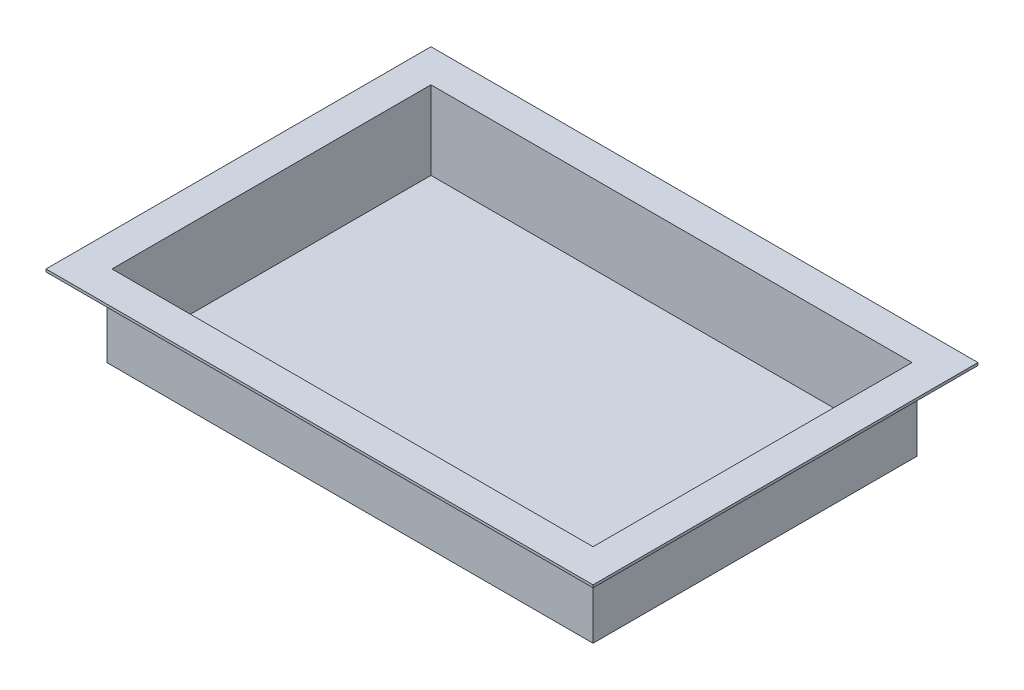
ISO-10303-21;
HEADER;
FILE_DESCRIPTION(('STEP AP214'),'2;1');
FILE_NAME('part.step','',(''),(''),'','','');
FILE_SCHEMA(('AUTOMOTIVE_DESIGN { 1 0 10303 214 1 1 1 1 }'));
ENDSEC;
DATA;
#1=APPLICATION_CONTEXT('core data for automotive mechanical design processes');
#2=APPLICATION_PROTOCOL_DEFINITION('international standard','automotive_design',2000,#1);
#3=PRODUCT_CONTEXT('',#1,'mechanical');
#4=PRODUCT('Part','Part','',(#3));
#5=PRODUCT_RELATED_PRODUCT_CATEGORY('part','',(#4));
#6=PRODUCT_DEFINITION_FORMATION('','',#4);
#7=PRODUCT_DEFINITION_CONTEXT('part definition',#1,'design');
#8=PRODUCT_DEFINITION('design','',#6,#7);
#9=PRODUCT_DEFINITION_SHAPE('','',#8);
#10=(LENGTH_UNIT() NAMED_UNIT(*) SI_UNIT(.MILLI.,.METRE.));
#11=(NAMED_UNIT(*) PLANE_ANGLE_UNIT() SI_UNIT($,.RADIAN.));
#12=(NAMED_UNIT(*) SI_UNIT($,.STERADIAN.) SOLID_ANGLE_UNIT());
#13=UNCERTAINTY_MEASURE_WITH_UNIT(LENGTH_MEASURE(1.E-05),#10,'distance_accuracy_value','');
#14=(GEOMETRIC_REPRESENTATION_CONTEXT(3) GLOBAL_UNCERTAINTY_ASSIGNED_CONTEXT((#13)) GLOBAL_UNIT_ASSIGNED_CONTEXT((#10,
#11,#12)) REPRESENTATION_CONTEXT('',''));
#15=CARTESIAN_POINT('',(0.,0.,0.));
#16=DIRECTION('',(0.,0.,1.));
#17=DIRECTION('',(1.,0.,0.));
#18=AXIS2_PLACEMENT_3D('',#15,#16,#17);
#19=CARTESIAN_POINT('',(76.2,0.,50.8));
#20=DIRECTION('',(0.,1.,0.));
#21=DIRECTION('',(0.,0.,1.));
#22=AXIS2_PLACEMENT_3D('',#19,#20,#21);
#23=PLANE('',#22);
#24=DIRECTION('',(0.,0.,-1.));
#25=VECTOR('',#24,1.);
#26=CARTESIAN_POINT('',(75.3872,0.,50.8));
#27=LINE('',#26,#25);
#28=CARTESIAN_POINT('',(75.3872,0.,49.9872));
#29=VERTEX_POINT('',#28);
#30=CARTESIAN_POINT('',(75.3872,0.,-49.9872));
#31=VERTEX_POINT('',#30);
#32=EDGE_CURVE('E160',#29,#31,#27,.T.);
#33=ORIENTED_EDGE('',*,*,#32,.F.);
#34=DIRECTION('',(1.,0.,0.));
#35=VECTOR('',#34,1.);
#36=CARTESIAN_POINT('',(76.2,0.,49.9872));
#37=LINE('',#36,#35);
#38=CARTESIAN_POINT('',(-75.3872,0.,49.9872));
#39=VERTEX_POINT('',#38);
#40=EDGE_CURVE('E152',#39,#29,#37,.T.);
#41=ORIENTED_EDGE('',*,*,#40,.F.);
#42=DIRECTION('',(0.,0.,1.));
#43=VECTOR('',#42,1.);
#44=CARTESIAN_POINT('',(-75.3872,0.,50.8));
#45=LINE('',#44,#43);
#46=CARTESIAN_POINT('',(-75.3872,0.,-49.9872));
#47=VERTEX_POINT('',#46);
#48=EDGE_CURVE('E56',#47,#39,#45,.T.);
#49=ORIENTED_EDGE('',*,*,#48,.F.);
#50=DIRECTION('',(-1.,0.,0.));
#51=VECTOR('',#50,1.);
#52=CARTESIAN_POINT('',(76.2,0.,-49.9872));
#53=LINE('',#52,#51);
#54=EDGE_CURVE('E157',#31,#47,#53,.T.);
#55=ORIENTED_EDGE('',*,*,#54,.F.);
#56=EDGE_LOOP('',(#33,#41,#49,#55));
#57=FACE_BOUND('',#56,.T.);
#58=DIRECTION('',(-1.,0.,0.));
#59=VECTOR('',#58,1.);
#60=CARTESIAN_POINT('',(85.725,0.,-60.325));
#61=LINE('',#60,#59);
#62=CARTESIAN_POINT('',(85.725,0.,-60.325));
#63=VERTEX_POINT('',#62);
#64=CARTESIAN_POINT('',(-85.725,0.,-60.3249999999999));
#65=VERTEX_POINT('',#64);
#66=EDGE_CURVE('E200',#63,#65,#61,.T.);
#67=ORIENTED_EDGE('',*,*,#66,.T.);
#68=DIRECTION('',(0.,0.,1.));
#69=VECTOR('',#68,1.);
#70=CARTESIAN_POINT('',(-85.725,0.,-60.3249999999999));
#71=LINE('',#70,#69);
#72=CARTESIAN_POINT('',(-85.725,0.,60.325));
#73=VERTEX_POINT('',#72);
#74=EDGE_CURVE('E197',#65,#73,#71,.T.);
#75=ORIENTED_EDGE('',*,*,#74,.T.);
#76=DIRECTION('',(1.,0.,0.));
#77=VECTOR('',#76,1.);
#78=CARTESIAN_POINT('',(-85.725,0.,60.325));
#79=LINE('',#78,#77);
#80=CARTESIAN_POINT('',(85.725,0.,60.325));
#81=VERTEX_POINT('',#80);
#82=EDGE_CURVE('E194',#73,#81,#79,.T.);
#83=ORIENTED_EDGE('',*,*,#82,.T.);
#84=DIRECTION('',(0.,0.,-1.));
#85=VECTOR('',#84,1.);
#86=CARTESIAN_POINT('',(85.725,0.,60.325));
#87=LINE('',#86,#85);
#88=EDGE_CURVE('E190',#81,#63,#87,.T.);
#89=ORIENTED_EDGE('',*,*,#88,.T.);
#90=EDGE_LOOP('',(#67,#75,#83,#89));
#91=FACE_BOUND('',#90,.T.);
#92=ADVANCED_FACE('F31',(#57,#91),#23,.T.);
#93=CARTESIAN_POINT('',(75.3872,-25.4,-50.8));
#94=DIRECTION('',(1.,0.,0.));
#95=DIRECTION('',(0.,0.,-1.));
#96=AXIS2_PLACEMENT_3D('',#93,#94,#95);
#97=PLANE('',#96);
#98=ORIENTED_EDGE('',*,*,#32,.T.);
#99=DIRECTION('',(0.,1.,0.));
#100=VECTOR('',#99,1.);
#101=CARTESIAN_POINT('',(75.3872,-25.4,-49.9872));
#102=LINE('',#101,#100);
#103=CARTESIAN_POINT('',(75.3872,-24.5872,-49.9872));
#104=VERTEX_POINT('',#103);
#105=EDGE_CURVE('E174',#104,#31,#102,.T.);
#106=ORIENTED_EDGE('',*,*,#105,.F.);
#107=DIRECTION('',(0.,0.,-1.));
#108=VECTOR('',#107,1.);
#109=CARTESIAN_POINT('',(75.3872,-24.5872,50.8));
#110=LINE('',#109,#108);
#111=CARTESIAN_POINT('',(75.3872,-24.5872,49.9872));
#112=VERTEX_POINT('',#111);
#113=EDGE_CURVE('E155',#112,#104,#110,.T.);
#114=ORIENTED_EDGE('',*,*,#113,.F.);
#115=DIRECTION('',(0.,1.,0.));
#116=VECTOR('',#115,1.);
#117=CARTESIAN_POINT('',(75.3872,-25.4,49.9872));
#118=LINE('',#117,#116);
#119=EDGE_CURVE('E151',#112,#29,#118,.T.);
#120=ORIENTED_EDGE('',*,*,#119,.T.);
#121=EDGE_LOOP('',(#98,#106,#114,#120));
#122=FACE_BOUND('',#121,.T.);
#123=ADVANCED_FACE('F232',(#122),#97,.F.);
#124=CARTESIAN_POINT('',(-76.2,-25.4,49.9872));
#125=DIRECTION('',(0.,0.,1.));
#126=DIRECTION('',(1.,0.,0.));
#127=AXIS2_PLACEMENT_3D('',#124,#125,#126);
#128=PLANE('',#127);
#129=ORIENTED_EDGE('',*,*,#40,.T.);
#130=ORIENTED_EDGE('',*,*,#119,.F.);
#131=DIRECTION('',(1.,0.,0.));
#132=VECTOR('',#131,1.);
#133=CARTESIAN_POINT('',(76.2,-24.5872,49.9872));
#134=LINE('',#133,#132);
#135=CARTESIAN_POINT('',(-75.3872,-24.5872,49.9872));
#136=VERTEX_POINT('',#135);
#137=EDGE_CURVE('E170',#136,#112,#134,.T.);
#138=ORIENTED_EDGE('',*,*,#137,.F.);
#139=DIRECTION('',(0.,1.,0.));
#140=VECTOR('',#139,1.);
#141=CARTESIAN_POINT('',(-75.3872,-25.4,49.9872));
#142=LINE('',#141,#140);
#143=EDGE_CURVE('E173',#136,#39,#142,.T.);
#144=ORIENTED_EDGE('',*,*,#143,.T.);
#145=EDGE_LOOP('',(#129,#130,#138,#144));
#146=FACE_BOUND('',#145,.T.);
#147=ADVANCED_FACE('F238',(#146),#128,.F.);
#148=CARTESIAN_POINT('',(-75.3872,-25.4,-50.8));
#149=DIRECTION('',(-1.,0.,0.));
#150=DIRECTION('',(0.,0.,1.));
#151=AXIS2_PLACEMENT_3D('',#148,#149,#150);
#152=PLANE('',#151);
#153=ORIENTED_EDGE('',*,*,#48,.T.);
#154=ORIENTED_EDGE('',*,*,#143,.F.);
#155=DIRECTION('',(0.,0.,1.));
#156=VECTOR('',#155,1.);
#157=CARTESIAN_POINT('',(-75.3872,-24.5872,50.8));
#158=LINE('',#157,#156);
#159=CARTESIAN_POINT('',(-75.3872,-24.5872,-49.9872));
#160=VERTEX_POINT('',#159);
#161=EDGE_CURVE('E167',#160,#136,#158,.T.);
#162=ORIENTED_EDGE('',*,*,#161,.F.);
#163=DIRECTION('',(0.,1.,0.));
#164=VECTOR('',#163,1.);
#165=CARTESIAN_POINT('',(-75.3872,-25.4,-49.9872));
#166=LINE('',#165,#164);
#167=EDGE_CURVE('E171',#160,#47,#166,.T.);
#168=ORIENTED_EDGE('',*,*,#167,.T.);
#169=EDGE_LOOP('',(#153,#154,#162,#168));
#170=FACE_BOUND('',#169,.T.);
#171=ADVANCED_FACE('F339',(#170),#152,.F.);
#172=CARTESIAN_POINT('',(-76.2,-25.4,-49.9872));
#173=DIRECTION('',(0.,0.,-1.));
#174=DIRECTION('',(-1.,0.,0.));
#175=AXIS2_PLACEMENT_3D('',#172,#173,#174);
#176=PLANE('',#175);
#177=ORIENTED_EDGE('',*,*,#54,.T.);
#178=ORIENTED_EDGE('',*,*,#167,.F.);
#179=DIRECTION('',(-1.,0.,0.));
#180=VECTOR('',#179,1.);
#181=CARTESIAN_POINT('',(76.2,-24.5872,-49.9872));
#182=LINE('',#181,#180);
#183=EDGE_CURVE('E164',#104,#160,#182,.T.);
#184=ORIENTED_EDGE('',*,*,#183,.F.);
#185=ORIENTED_EDGE('',*,*,#105,.T.);
#186=EDGE_LOOP('',(#177,#178,#184,#185));
#187=FACE_BOUND('',#186,.T.);
#188=ADVANCED_FACE('F330',(#187),#176,.F.);
#189=CARTESIAN_POINT('',(76.2,-24.5872,50.8));
#190=DIRECTION('',(0.,1.,0.));
#191=DIRECTION('',(0.,0.,1.));
#192=AXIS2_PLACEMENT_3D('',#189,#190,#191);
#193=PLANE('',#192);
#194=ORIENTED_EDGE('',*,*,#113,.T.);
#195=ORIENTED_EDGE('',*,*,#183,.T.);
#196=ORIENTED_EDGE('',*,*,#161,.T.);
#197=ORIENTED_EDGE('',*,*,#137,.T.);
#198=EDGE_LOOP('',(#194,#195,#196,#197));
#199=FACE_BOUND('',#198,.T.);
#200=ADVANCED_FACE('F316',(#199),#193,.T.);
#201=CARTESIAN_POINT('',(85.725,-0.812799999999999,-60.325));
#202=DIRECTION('',(0.,0.,-1.));
#203=DIRECTION('',(-1.,0.,0.));
#204=AXIS2_PLACEMENT_3D('',#201,#202,#203);
#205=PLANE('',#204);
#206=ORIENTED_EDGE('',*,*,#66,.F.);
#207=DIRECTION('',(0.,1.,0.));
#208=VECTOR('',#207,1.);
#209=CARTESIAN_POINT('',(85.725,-0.812799999999999,-60.325));
#210=LINE('',#209,#208);
#211=CARTESIAN_POINT('',(85.725,-0.812799999999999,-60.325));
#212=VERTEX_POINT('',#211);
#213=EDGE_CURVE('E163',#212,#63,#210,.T.);
#214=ORIENTED_EDGE('',*,*,#213,.F.);
#215=DIRECTION('',(-1.,0.,0.));
#216=VECTOR('',#215,1.);
#217=CARTESIAN_POINT('',(85.725,-0.812799999999999,-60.325));
#218=LINE('',#217,#216);
#219=CARTESIAN_POINT('',(-85.725,-0.812799999999999,-60.3249999999999));
#220=VERTEX_POINT('',#219);
#221=EDGE_CURVE('E193',#212,#220,#218,.T.);
#222=ORIENTED_EDGE('',*,*,#221,.T.);
#223=DIRECTION('',(0.,1.,0.));
#224=VECTOR('',#223,1.);
#225=CARTESIAN_POINT('',(-85.725,-0.812799999999999,-60.3249999999999));
#226=LINE('',#225,#224);
#227=EDGE_CURVE('E182',#220,#65,#226,.T.);
#228=ORIENTED_EDGE('',*,*,#227,.T.);
#229=EDGE_LOOP('',(#206,#214,#222,#228));
#230=FACE_BOUND('',#229,.T.);
#231=ADVANCED_FACE('F217',(#230),#205,.T.);
#232=CARTESIAN_POINT('',(85.725,-0.812799999999999,60.325));
#233=DIRECTION('',(1.,0.,0.));
#234=DIRECTION('',(0.,0.,-1.));
#235=AXIS2_PLACEMENT_3D('',#232,#233,#234);
#236=PLANE('',#235);
#237=ORIENTED_EDGE('',*,*,#88,.F.);
#238=DIRECTION('',(0.,1.,0.));
#239=VECTOR('',#238,1.);
#240=CARTESIAN_POINT('',(85.725,-0.812799999999999,60.325));
#241=LINE('',#240,#239);
#242=CARTESIAN_POINT('',(85.725,-0.812799999999999,60.325));
#243=VERTEX_POINT('',#242);
#244=EDGE_CURVE('E187',#243,#81,#241,.T.);
#245=ORIENTED_EDGE('',*,*,#244,.F.);
#246=DIRECTION('',(0.,0.,-1.));
#247=VECTOR('',#246,1.);
#248=CARTESIAN_POINT('',(85.725,-0.812799999999999,60.325));
#249=LINE('',#248,#247);
#250=EDGE_CURVE('E185',#243,#212,#249,.T.);
#251=ORIENTED_EDGE('',*,*,#250,.T.);
#252=ORIENTED_EDGE('',*,*,#213,.T.);
#253=EDGE_LOOP('',(#237,#245,#251,#252));
#254=FACE_BOUND('',#253,.T.);
#255=ADVANCED_FACE('F224',(#254),#236,.T.);
#256=CARTESIAN_POINT('',(-85.725,-0.812799999999999,60.325));
#257=DIRECTION('',(0.,0.,1.));
#258=DIRECTION('',(1.,0.,0.));
#259=AXIS2_PLACEMENT_3D('',#256,#257,#258);
#260=PLANE('',#259);
#261=ORIENTED_EDGE('',*,*,#82,.F.);
#262=DIRECTION('',(0.,1.,0.));
#263=VECTOR('',#262,1.);
#264=CARTESIAN_POINT('',(-85.725,-0.812799999999999,60.325));
#265=LINE('',#264,#263);
#266=CARTESIAN_POINT('',(-85.725,-0.812799999999999,60.325));
#267=VERTEX_POINT('',#266);
#268=EDGE_CURVE('E184',#267,#73,#265,.T.);
#269=ORIENTED_EDGE('',*,*,#268,.F.);
#270=DIRECTION('',(1.,0.,0.));
#271=VECTOR('',#270,1.);
#272=CARTESIAN_POINT('',(-85.725,-0.812799999999999,60.325));
#273=LINE('',#272,#271);
#274=EDGE_CURVE('E205',#267,#243,#273,.T.);
#275=ORIENTED_EDGE('',*,*,#274,.T.);
#276=ORIENTED_EDGE('',*,*,#244,.T.);
#277=EDGE_LOOP('',(#261,#269,#275,#276));
#278=FACE_BOUND('',#277,.T.);
#279=ADVANCED_FACE('F227',(#278),#260,.T.);
#280=CARTESIAN_POINT('',(-85.725,-0.812799999999999,-60.3249999999999));
#281=DIRECTION('',(-1.,0.,0.));
#282=DIRECTION('',(0.,0.,1.));
#283=AXIS2_PLACEMENT_3D('',#280,#281,#282);
#284=PLANE('',#283);
#285=ORIENTED_EDGE('',*,*,#74,.F.);
#286=ORIENTED_EDGE('',*,*,#227,.F.);
#287=DIRECTION('',(0.,0.,1.));
#288=VECTOR('',#287,1.);
#289=CARTESIAN_POINT('',(-85.725,-0.812799999999999,-60.3249999999999));
#290=LINE('',#289,#288);
#291=EDGE_CURVE('E208',#220,#267,#290,.T.);
#292=ORIENTED_EDGE('',*,*,#291,.T.);
#293=ORIENTED_EDGE('',*,*,#268,.T.);
#294=EDGE_LOOP('',(#285,#286,#292,#293));
#295=FACE_BOUND('',#294,.T.);
#296=ADVANCED_FACE('F229',(#295),#284,.T.);
#297=CARTESIAN_POINT('',(-85.725,-0.812799999999999,-60.3249999999999));
#298=DIRECTION('',(0.,1.,0.));
#299=DIRECTION('',(0.,0.,1.));
#300=AXIS2_PLACEMENT_3D('',#297,#298,#299);
#301=PLANE('',#300);
#302=DIRECTION('',(-1.,0.,0.));
#303=VECTOR('',#302,1.);
#304=CARTESIAN_POINT('',(76.2,-0.812799999999999,-50.8));
#305=LINE('',#304,#303);
#306=CARTESIAN_POINT('',(76.2,-0.812799999999999,-50.8));
#307=VERTEX_POINT('',#306);
#308=CARTESIAN_POINT('',(-76.2,-0.812799999999999,-50.8));
#309=VERTEX_POINT('',#308);
#310=EDGE_CURVE('E125',#307,#309,#305,.T.);
#311=ORIENTED_EDGE('',*,*,#310,.T.);
#312=DIRECTION('',(0.,0.,1.));
#313=VECTOR('',#312,1.);
#314=CARTESIAN_POINT('',(-76.2,-0.812799999999999,-50.8));
#315=LINE('',#314,#313);
#316=CARTESIAN_POINT('',(-76.2,-0.812799999999999,50.8));
#317=VERTEX_POINT('',#316);
#318=EDGE_CURVE('E120',#309,#317,#315,.T.);
#319=ORIENTED_EDGE('',*,*,#318,.T.);
#320=DIRECTION('',(1.,0.,0.));
#321=VECTOR('',#320,1.);
#322=CARTESIAN_POINT('',(-76.2,-0.812799999999999,50.8));
#323=LINE('',#322,#321);
#324=CARTESIAN_POINT('',(76.2,-0.812799999999999,50.8));
#325=VERTEX_POINT('',#324);
#326=EDGE_CURVE('E124',#317,#325,#323,.T.);
#327=ORIENTED_EDGE('',*,*,#326,.T.);
#328=DIRECTION('',(0.,0.,-1.));
#329=VECTOR('',#328,1.);
#330=CARTESIAN_POINT('',(76.2,-0.812799999999999,50.8));
#331=LINE('',#330,#329);
#332=EDGE_CURVE('E48',#325,#307,#331,.T.);
#333=ORIENTED_EDGE('',*,*,#332,.T.);
#334=EDGE_LOOP('',(#311,#319,#327,#333));
#335=FACE_BOUND('',#334,.T.);
#336=ORIENTED_EDGE('',*,*,#221,.F.);
#337=ORIENTED_EDGE('',*,*,#250,.F.);
#338=ORIENTED_EDGE('',*,*,#274,.F.);
#339=ORIENTED_EDGE('',*,*,#291,.F.);
#340=EDGE_LOOP('',(#336,#337,#338,#339));
#341=FACE_BOUND('',#340,.T.);
#342=ADVANCED_FACE('F122',(#335,#341),#301,.F.);
#343=CARTESIAN_POINT('',(76.2,-25.4,50.8));
#344=DIRECTION('',(0.,1.,0.));
#345=DIRECTION('',(0.,0.,1.));
#346=AXIS2_PLACEMENT_3D('',#343,#344,#345);
#347=PLANE('',#346);
#348=DIRECTION('',(0.,0.,-1.));
#349=VECTOR('',#348,1.);
#350=CARTESIAN_POINT('',(76.2,-25.4,-50.8));
#351=LINE('',#350,#349);
#352=CARTESIAN_POINT('',(76.2,-25.4,50.8));
#353=VERTEX_POINT('',#352);
#354=CARTESIAN_POINT('',(76.2,-25.4,-50.8));
#355=VERTEX_POINT('',#354);
#356=EDGE_CURVE('E148',#353,#355,#351,.T.);
#357=ORIENTED_EDGE('',*,*,#356,.F.);
#358=DIRECTION('',(1.,0.,0.));
#359=VECTOR('',#358,1.);
#360=CARTESIAN_POINT('',(-76.2,-25.4,50.8));
#361=LINE('',#360,#359);
#362=CARTESIAN_POINT('',(-76.2,-25.4,50.8));
#363=VERTEX_POINT('',#362);
#364=EDGE_CURVE('E142',#363,#353,#361,.T.);
#365=ORIENTED_EDGE('',*,*,#364,.F.);
#366=DIRECTION('',(0.,0.,1.));
#367=VECTOR('',#366,1.);
#368=CARTESIAN_POINT('',(-76.2,-25.4,-50.8));
#369=LINE('',#368,#367);
#370=CARTESIAN_POINT('',(-76.2,-25.4,-50.8));
#371=VERTEX_POINT('',#370);
#372=EDGE_CURVE('E137',#371,#363,#369,.T.);
#373=ORIENTED_EDGE('',*,*,#372,.F.);
#374=DIRECTION('',(-1.,0.,0.));
#375=VECTOR('',#374,1.);
#376=CARTESIAN_POINT('',(-76.2,-25.4,-50.8));
#377=LINE('',#376,#375);
#378=EDGE_CURVE('E145',#355,#371,#377,.T.);
#379=ORIENTED_EDGE('',*,*,#378,.F.);
#380=EDGE_LOOP('',(#357,#365,#373,#379));
#381=FACE_BOUND('',#380,.T.);
#382=ADVANCED_FACE('F244',(#381),#347,.F.);
#383=CARTESIAN_POINT('',(-76.2,-25.4,-50.8));
#384=DIRECTION('',(0.,0.,-1.));
#385=DIRECTION('',(-1.,0.,0.));
#386=AXIS2_PLACEMENT_3D('',#383,#384,#385);
#387=PLANE('',#386);
#388=DIRECTION('',(0.,1.,0.));
#389=VECTOR('',#388,1.);
#390=CARTESIAN_POINT('',(-76.2,-25.4,-50.8));
#391=LINE('',#390,#389);
#392=EDGE_CURVE('E139',#371,#309,#391,.T.);
#393=ORIENTED_EDGE('',*,*,#392,.T.);
#394=ORIENTED_EDGE('',*,*,#310,.F.);
#395=DIRECTION('',(0.,1.,0.));
#396=VECTOR('',#395,1.);
#397=CARTESIAN_POINT('',(76.2,-25.4,-50.8));
#398=LINE('',#397,#396);
#399=EDGE_CURVE('E35',#355,#307,#398,.T.);
#400=ORIENTED_EDGE('',*,*,#399,.F.);
#401=ORIENTED_EDGE('',*,*,#378,.T.);
#402=EDGE_LOOP('',(#393,#394,#400,#401));
#403=FACE_BOUND('',#402,.T.);
#404=ADVANCED_FACE('F249',(#403),#387,.T.);
#405=CARTESIAN_POINT('',(-76.2,-25.4,-50.8));
#406=DIRECTION('',(-1.,0.,0.));
#407=DIRECTION('',(0.,0.,1.));
#408=AXIS2_PLACEMENT_3D('',#405,#406,#407);
#409=PLANE('',#408);
#410=DIRECTION('',(0.,1.,0.));
#411=VECTOR('',#410,1.);
#412=CARTESIAN_POINT('',(-76.2,-25.4,50.8));
#413=LINE('',#412,#411);
#414=EDGE_CURVE('E40',#363,#317,#413,.T.);
#415=ORIENTED_EDGE('',*,*,#414,.T.);
#416=ORIENTED_EDGE('',*,*,#318,.F.);
#417=ORIENTED_EDGE('',*,*,#392,.F.);
#418=ORIENTED_EDGE('',*,*,#372,.T.);
#419=EDGE_LOOP('',(#415,#416,#417,#418));
#420=FACE_BOUND('',#419,.T.);
#421=ADVANCED_FACE('F135',(#420),#409,.T.);
#422=CARTESIAN_POINT('',(-76.2,-25.4,50.8));
#423=DIRECTION('',(0.,0.,1.));
#424=DIRECTION('',(1.,0.,0.));
#425=AXIS2_PLACEMENT_3D('',#422,#423,#424);
#426=PLANE('',#425);
#427=DIRECTION('',(0.,1.,0.));
#428=VECTOR('',#427,1.);
#429=CARTESIAN_POINT('',(76.2,-25.4,50.8));
#430=LINE('',#429,#428);
#431=EDGE_CURVE('E11',#353,#325,#430,.T.);
#432=ORIENTED_EDGE('',*,*,#431,.T.);
#433=ORIENTED_EDGE('',*,*,#326,.F.);
#434=ORIENTED_EDGE('',*,*,#414,.F.);
#435=ORIENTED_EDGE('',*,*,#364,.T.);
#436=EDGE_LOOP('',(#432,#433,#434,#435));
#437=FACE_BOUND('',#436,.T.);
#438=ADVANCED_FACE('F131',(#437),#426,.T.);
#439=CARTESIAN_POINT('',(76.2,-25.4,-50.8));
#440=DIRECTION('',(1.,0.,0.));
#441=DIRECTION('',(0.,0.,-1.));
#442=AXIS2_PLACEMENT_3D('',#439,#440,#441);
#443=PLANE('',#442);
#444=ORIENTED_EDGE('',*,*,#399,.T.);
#445=ORIENTED_EDGE('',*,*,#332,.F.);
#446=ORIENTED_EDGE('',*,*,#431,.F.);
#447=ORIENTED_EDGE('',*,*,#356,.T.);
#448=EDGE_LOOP('',(#444,#445,#446,#447));
#449=FACE_BOUND('',#448,.T.);
#450=ADVANCED_FACE('F33',(#449),#443,.T.);
#451=CLOSED_SHELL('',(#92,#123,#147,#171,#188,#200,#231,#255,#279,#296,#342,#382,#404,#421,#438,#450));
#452=MANIFOLD_SOLID_BREP('B2',#451);
#453=ADVANCED_BREP_SHAPE_REPRESENTATION('',(#18,#452),#14);
#454=SHAPE_DEFINITION_REPRESENTATION(#9,#453);
ENDSEC;
END-ISO-10303-21;
